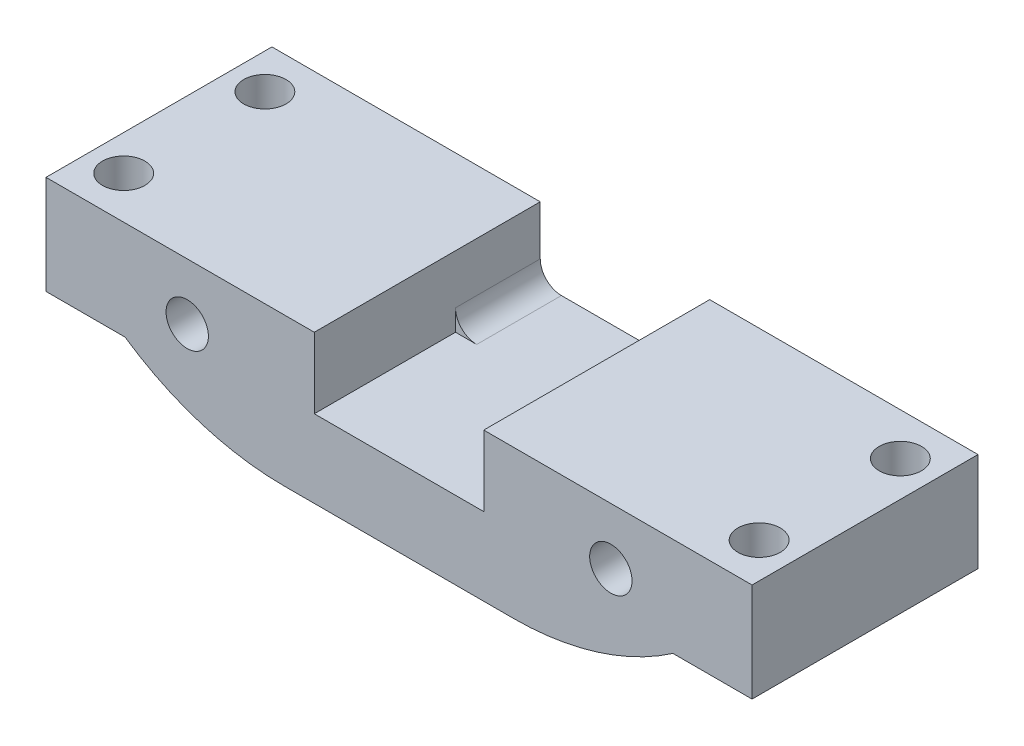
ISO-10303-21;
HEADER;
FILE_DESCRIPTION(('STEP AP214'),'2;1');
FILE_NAME('part.step','',(''),(''),'','','');
FILE_SCHEMA(('AUTOMOTIVE_DESIGN { 1 0 10303 214 1 1 1 1 }'));
ENDSEC;
DATA;
#1=APPLICATION_CONTEXT('core data for automotive mechanical design processes');
#2=APPLICATION_PROTOCOL_DEFINITION('international standard','automotive_design',2000,#1);
#3=PRODUCT_CONTEXT('',#1,'mechanical');
#4=PRODUCT('Part','Part','',(#3));
#5=PRODUCT_RELATED_PRODUCT_CATEGORY('part','',(#4));
#6=PRODUCT_DEFINITION_FORMATION('','',#4);
#7=PRODUCT_DEFINITION_CONTEXT('part definition',#1,'design');
#8=PRODUCT_DEFINITION('design','',#6,#7);
#9=PRODUCT_DEFINITION_SHAPE('','',#8);
#10=(LENGTH_UNIT() NAMED_UNIT(*) SI_UNIT(.MILLI.,.METRE.));
#11=(NAMED_UNIT(*) PLANE_ANGLE_UNIT() SI_UNIT($,.RADIAN.));
#12=(NAMED_UNIT(*) SI_UNIT($,.STERADIAN.) SOLID_ANGLE_UNIT());
#13=UNCERTAINTY_MEASURE_WITH_UNIT(LENGTH_MEASURE(1.E-05),#10,'distance_accuracy_value','');
#14=(GEOMETRIC_REPRESENTATION_CONTEXT(3) GLOBAL_UNCERTAINTY_ASSIGNED_CONTEXT((#13)) GLOBAL_UNIT_ASSIGNED_CONTEXT((#10,
#11,#12)) REPRESENTATION_CONTEXT('',''));
#15=CARTESIAN_POINT('',(0.,0.,0.));
#16=DIRECTION('',(0.,0.,1.));
#17=DIRECTION('',(1.,0.,0.));
#18=AXIS2_PLACEMENT_3D('',#15,#16,#17);
#19=CARTESIAN_POINT('',(0.,14.9,10.));
#20=DIRECTION('',(0.,1.,0.));
#21=DIRECTION('',(-1.,0.,0.));
#22=AXIS2_PLACEMENT_3D('',#19,#20,#21);
#23=PLANE('',#22);
#24=CARTESIAN_POINT('',(45.5,14.9,7.));
#25=DIRECTION('',(0.,1.,0.));
#26=DIRECTION('',(-1.,0.,0.));
#27=AXIS2_PLACEMENT_3D('',#24,#25,#26);
#28=CIRCLE('',#27,1.5);
#29=CARTESIAN_POINT('',(44.,14.9,7.));
#30=VERTEX_POINT('',#29);
#31=EDGE_CURVE('E355',#30,#30,#28,.T.);
#32=ORIENTED_EDGE('',*,*,#31,.F.);
#33=EDGE_LOOP('',(#32));
#34=FACE_BOUND('',#33,.T.);
#35=CARTESIAN_POINT('',(45.4999999999999,14.9,-3.00000000000001));
#36=DIRECTION('',(0.,1.,0.));
#37=DIRECTION('',(-1.,0.,0.));
#38=AXIS2_PLACEMENT_3D('',#35,#36,#37);
#39=CIRCLE('',#38,1.5);
#40=CARTESIAN_POINT('',(43.9999999999999,14.9,-3.00000000000001));
#41=VERTEX_POINT('',#40);
#42=EDGE_CURVE('E351',#41,#41,#39,.T.);
#43=ORIENTED_EDGE('',*,*,#42,.F.);
#44=EDGE_LOOP('',(#43));
#45=FACE_BOUND('',#44,.T.);
#46=DIRECTION('',(0.,0.,-1.));
#47=VECTOR('',#46,1.);
#48=CARTESIAN_POINT('',(48.,14.9,10.));
#49=LINE('',#48,#47);
#50=CARTESIAN_POINT('',(48.,14.9,10.));
#51=VERTEX_POINT('',#50);
#52=CARTESIAN_POINT('',(48.,14.9,-6.));
#53=VERTEX_POINT('',#52);
#54=EDGE_CURVE('E168',#51,#53,#49,.T.);
#55=ORIENTED_EDGE('',*,*,#54,.T.);
#56=DIRECTION('',(1.,0.,0.));
#57=VECTOR('',#56,1.);
#58=CARTESIAN_POINT('',(29.,14.9,-6.));
#59=LINE('',#58,#57);
#60=CARTESIAN_POINT('',(29.,14.9,-6.));
#61=VERTEX_POINT('',#60);
#62=EDGE_CURVE('E184',#61,#53,#59,.T.);
#63=ORIENTED_EDGE('',*,*,#62,.F.);
#64=DIRECTION('',(0.,0.,-1.));
#65=VECTOR('',#64,1.);
#66=CARTESIAN_POINT('',(29.,14.9,10.));
#67=LINE('',#66,#65);
#68=CARTESIAN_POINT('',(29.,14.9,10.));
#69=VERTEX_POINT('',#68);
#70=EDGE_CURVE('E337',#69,#61,#67,.T.);
#71=ORIENTED_EDGE('',*,*,#70,.F.);
#72=DIRECTION('',(1.,0.,0.));
#73=VECTOR('',#72,1.);
#74=CARTESIAN_POINT('',(0.,14.9,10.));
#75=LINE('',#74,#73);
#76=EDGE_CURVE('E262',#69,#51,#75,.T.);
#77=ORIENTED_EDGE('',*,*,#76,.T.);
#78=EDGE_LOOP('',(#55,#63,#71,#77));
#79=FACE_BOUND('',#78,.T.);
#80=ADVANCED_FACE('F41',(#34,#45,#79),#23,.T.);
#81=CARTESIAN_POINT('',(29.,0.,10.));
#82=DIRECTION('',(1.,0.,0.));
#83=DIRECTION('',(0.,0.,-1.));
#84=AXIS2_PLACEMENT_3D('',#81,#82,#83);
#85=PLANE('',#84);
#86=ORIENTED_EDGE('',*,*,#70,.T.);
#87=DIRECTION('',(0.,1.,0.));
#88=VECTOR('',#87,1.);
#89=CARTESIAN_POINT('',(29.,11.4,-6.));
#90=LINE('',#89,#88);
#91=CARTESIAN_POINT('',(29.,11.4,-6.));
#92=VERTEX_POINT('',#91);
#93=EDGE_CURVE('E230',#92,#61,#90,.T.);
#94=ORIENTED_EDGE('',*,*,#93,.F.);
#95=DIRECTION('',(0.,0.,1.));
#96=VECTOR('',#95,1.);
#97=CARTESIAN_POINT('',(29.,11.4,-6.));
#98=LINE('',#97,#96);
#99=CARTESIAN_POINT('',(29.,11.4,0.));
#100=VERTEX_POINT('',#99);
#101=EDGE_CURVE('E235',#92,#100,#98,.T.);
#102=ORIENTED_EDGE('',*,*,#101,.T.);
#103=DIRECTION('',(0.,-1.,0.));
#104=VECTOR('',#103,1.);
#105=CARTESIAN_POINT('',(29.,0.,0.));
#106=LINE('',#105,#104);
#107=CARTESIAN_POINT('',(29.,9.9,0.));
#108=VERTEX_POINT('',#107);
#109=EDGE_CURVE('E303',#100,#108,#106,.T.);
#110=ORIENTED_EDGE('',*,*,#109,.T.);
#111=DIRECTION('',(0.,0.,-1.));
#112=VECTOR('',#111,1.);
#113=CARTESIAN_POINT('',(29.,9.9,10.));
#114=LINE('',#113,#112);
#115=CARTESIAN_POINT('',(29.,9.9,10.));
#116=VERTEX_POINT('',#115);
#117=EDGE_CURVE('E333',#116,#108,#114,.T.);
#118=ORIENTED_EDGE('',*,*,#117,.F.);
#119=DIRECTION('',(0.,-1.,0.));
#120=VECTOR('',#119,1.);
#121=CARTESIAN_POINT('',(29.,0.,10.));
#122=LINE('',#121,#120);
#123=EDGE_CURVE('E266',#69,#116,#122,.T.);
#124=ORIENTED_EDGE('',*,*,#123,.F.);
#125=EDGE_LOOP('',(#86,#94,#102,#110,#118,#124));
#126=FACE_BOUND('',#125,.T.);
#127=ADVANCED_FACE('F379',(#126),#85,.F.);
#128=CARTESIAN_POINT('',(0.,9.9,10.));
#129=DIRECTION('',(0.,1.,0.));
#130=DIRECTION('',(0.,0.,1.));
#131=AXIS2_PLACEMENT_3D('',#128,#129,#130);
#132=PLANE('',#131);
#133=DIRECTION('',(1.,0.,0.));
#134=VECTOR('',#133,1.);
#135=CARTESIAN_POINT('',(0.,9.9,0.));
#136=LINE('',#135,#134);
#137=CARTESIAN_POINT('',(17.,9.9,0.));
#138=VERTEX_POINT('',#137);
#139=CARTESIAN_POINT('',(18.5,9.9,0.));
#140=VERTEX_POINT('',#139);
#141=EDGE_CURVE('E308',#138,#140,#136,.T.);
#142=ORIENTED_EDGE('',*,*,#141,.F.);
#143=DIRECTION('',(0.,0.,-1.));
#144=VECTOR('',#143,1.);
#145=CARTESIAN_POINT('',(17.,9.9,10.));
#146=LINE('',#145,#144);
#147=CARTESIAN_POINT('',(17.,9.9,10.));
#148=VERTEX_POINT('',#147);
#149=EDGE_CURVE('E329',#148,#138,#146,.T.);
#150=ORIENTED_EDGE('',*,*,#149,.F.);
#151=DIRECTION('',(1.,0.,0.));
#152=VECTOR('',#151,1.);
#153=CARTESIAN_POINT('',(0.,9.9,10.));
#154=LINE('',#153,#152);
#155=EDGE_CURVE('E269',#148,#116,#154,.T.);
#156=ORIENTED_EDGE('',*,*,#155,.T.);
#157=ORIENTED_EDGE('',*,*,#117,.T.);
#158=CARTESIAN_POINT('',(27.5,9.9,0.));
#159=VERTEX_POINT('',#158);
#160=EDGE_CURVE('E307',#159,#108,#136,.T.);
#161=ORIENTED_EDGE('',*,*,#160,.F.);
#162=DIRECTION('',(0.,0.,1.));
#163=VECTOR('',#162,1.);
#164=CARTESIAN_POINT('',(27.5,9.9,-6.));
#165=LINE('',#164,#163);
#166=CARTESIAN_POINT('',(27.5,9.9,-6.));
#167=VERTEX_POINT('',#166);
#168=EDGE_CURVE('E242',#167,#159,#165,.T.);
#169=ORIENTED_EDGE('',*,*,#168,.F.);
#170=DIRECTION('',(1.,0.,0.));
#171=VECTOR('',#170,1.);
#172=CARTESIAN_POINT('',(18.5,9.9,-6.));
#173=LINE('',#172,#171);
#174=CARTESIAN_POINT('',(18.5,9.9,-6.));
#175=VERTEX_POINT('',#174);
#176=EDGE_CURVE('E224',#175,#167,#173,.T.);
#177=ORIENTED_EDGE('',*,*,#176,.F.);
#178=DIRECTION('',(0.,0.,1.));
#179=VECTOR('',#178,1.);
#180=CARTESIAN_POINT('',(18.5,9.9,-6.));
#181=LINE('',#180,#179);
#182=EDGE_CURVE('E245',#175,#140,#181,.T.);
#183=ORIENTED_EDGE('',*,*,#182,.T.);
#184=EDGE_LOOP('',(#142,#150,#156,#157,#161,#169,#177,#183));
#185=FACE_BOUND('',#184,.T.);
#186=ADVANCED_FACE('F414',(#185),#132,.T.);
#187=CARTESIAN_POINT('',(17.,0.,10.));
#188=DIRECTION('',(1.,0.,0.));
#189=DIRECTION('',(0.,0.,-1.));
#190=AXIS2_PLACEMENT_3D('',#187,#188,#189);
#191=PLANE('',#190);
#192=DIRECTION('',(0.,-1.,0.));
#193=VECTOR('',#192,1.);
#194=CARTESIAN_POINT('',(17.,0.,0.));
#195=LINE('',#194,#193);
#196=CARTESIAN_POINT('',(17.,11.4,0.));
#197=VERTEX_POINT('',#196);
#198=EDGE_CURVE('E258',#197,#138,#195,.T.);
#199=ORIENTED_EDGE('',*,*,#198,.F.);
#200=DIRECTION('',(0.,0.,1.));
#201=VECTOR('',#200,1.);
#202=CARTESIAN_POINT('',(17.,11.4,-6.));
#203=LINE('',#202,#201);
#204=CARTESIAN_POINT('',(17.,11.4,-6.));
#205=VERTEX_POINT('',#204);
#206=EDGE_CURVE('E249',#205,#197,#203,.T.);
#207=ORIENTED_EDGE('',*,*,#206,.F.);
#208=DIRECTION('',(0.,-1.,0.));
#209=VECTOR('',#208,1.);
#210=CARTESIAN_POINT('',(17.,14.9,-6.));
#211=LINE('',#210,#209);
#212=CARTESIAN_POINT('',(17.,14.9,-6.));
#213=VERTEX_POINT('',#212);
#214=EDGE_CURVE('E218',#213,#205,#211,.T.);
#215=ORIENTED_EDGE('',*,*,#214,.F.);
#216=DIRECTION('',(0.,0.,-1.));
#217=VECTOR('',#216,1.);
#218=CARTESIAN_POINT('',(17.,14.9,10.));
#219=LINE('',#218,#217);
#220=CARTESIAN_POINT('',(17.,14.9,10.));
#221=VERTEX_POINT('',#220);
#222=EDGE_CURVE('E326',#221,#213,#219,.T.);
#223=ORIENTED_EDGE('',*,*,#222,.F.);
#224=DIRECTION('',(0.,-1.,0.));
#225=VECTOR('',#224,1.);
#226=CARTESIAN_POINT('',(17.,0.,10.));
#227=LINE('',#226,#225);
#228=EDGE_CURVE('E273',#221,#148,#227,.T.);
#229=ORIENTED_EDGE('',*,*,#228,.T.);
#230=ORIENTED_EDGE('',*,*,#149,.T.);
#231=EDGE_LOOP('',(#199,#207,#215,#223,#229,#230));
#232=FACE_BOUND('',#231,.T.);
#233=ADVANCED_FACE('F408',(#232),#191,.T.);
#234=CARTESIAN_POINT('',(0.,14.9,10.));
#235=DIRECTION('',(0.,1.,0.));
#236=DIRECTION('',(-1.,0.,0.));
#237=AXIS2_PLACEMENT_3D('',#234,#235,#236);
#238=PLANE('',#237);
#239=CARTESIAN_POINT('',(0.499999999999979,14.9,-3.));
#240=DIRECTION('',(0.,1.,0.));
#241=DIRECTION('',(-1.,0.,0.));
#242=AXIS2_PLACEMENT_3D('',#239,#240,#241);
#243=CIRCLE('',#242,1.5);
#244=CARTESIAN_POINT('',(-1.00000000000002,14.9,-3.));
#245=VERTEX_POINT('',#244);
#246=EDGE_CURVE('E193',#245,#245,#243,.T.);
#247=ORIENTED_EDGE('',*,*,#246,.F.);
#248=EDGE_LOOP('',(#247));
#249=FACE_BOUND('',#248,.T.);
#250=CARTESIAN_POINT('',(0.499999999999975,14.9,7.));
#251=DIRECTION('',(0.,1.,0.));
#252=DIRECTION('',(-1.,0.,0.));
#253=AXIS2_PLACEMENT_3D('',#250,#251,#252);
#254=CIRCLE('',#253,1.5);
#255=CARTESIAN_POINT('',(-1.00000000000002,14.9,7.));
#256=VERTEX_POINT('',#255);
#257=EDGE_CURVE('E359',#256,#256,#254,.T.);
#258=ORIENTED_EDGE('',*,*,#257,.F.);
#259=EDGE_LOOP('',(#258));
#260=FACE_BOUND('',#259,.T.);
#261=ORIENTED_EDGE('',*,*,#222,.T.);
#262=DIRECTION('',(1.,0.,0.));
#263=VECTOR('',#262,1.);
#264=CARTESIAN_POINT('',(-2.00000000000002,14.9,-6.));
#265=LINE('',#264,#263);
#266=CARTESIAN_POINT('',(-2.00000000000002,14.9,-6.));
#267=VERTEX_POINT('',#266);
#268=EDGE_CURVE('E214',#267,#213,#265,.T.);
#269=ORIENTED_EDGE('',*,*,#268,.F.);
#270=DIRECTION('',(0.,0.,-1.));
#271=VECTOR('',#270,1.);
#272=CARTESIAN_POINT('',(-2.00000000000002,14.9,10.));
#273=LINE('',#272,#271);
#274=CARTESIAN_POINT('',(-2.00000000000002,14.9,10.));
#275=VERTEX_POINT('',#274);
#276=EDGE_CURVE('E323',#275,#267,#273,.T.);
#277=ORIENTED_EDGE('',*,*,#276,.F.);
#278=DIRECTION('',(1.,0.,0.));
#279=VECTOR('',#278,1.);
#280=CARTESIAN_POINT('',(0.,14.9,10.));
#281=LINE('',#280,#279);
#282=EDGE_CURVE('E277',#275,#221,#281,.T.);
#283=ORIENTED_EDGE('',*,*,#282,.T.);
#284=EDGE_LOOP('',(#261,#269,#277,#283));
#285=FACE_BOUND('',#284,.T.);
#286=ADVANCED_FACE('F404',(#249,#260,#285),#238,.T.);
#287=CARTESIAN_POINT('',(-2.00000000000002,0.,10.));
#288=DIRECTION('',(1.,0.,0.));
#289=DIRECTION('',(0.,1.,0.));
#290=AXIS2_PLACEMENT_3D('',#287,#288,#289);
#291=PLANE('',#290);
#292=ORIENTED_EDGE('',*,*,#276,.T.);
#293=DIRECTION('',(0.,1.,0.));
#294=VECTOR('',#293,1.);
#295=CARTESIAN_POINT('',(-2.00000000000002,7.9,-6.));
#296=LINE('',#295,#294);
#297=CARTESIAN_POINT('',(-2.00000000000002,7.9,-6.));
#298=VERTEX_POINT('',#297);
#299=EDGE_CURVE('E210',#298,#267,#296,.T.);
#300=ORIENTED_EDGE('',*,*,#299,.F.);
#301=DIRECTION('',(0.,0.,-1.));
#302=VECTOR('',#301,1.);
#303=CARTESIAN_POINT('',(-2.00000000000002,7.9,10.));
#304=LINE('',#303,#302);
#305=CARTESIAN_POINT('',(-2.00000000000002,7.9,10.));
#306=VERTEX_POINT('',#305);
#307=EDGE_CURVE('E320',#306,#298,#304,.T.);
#308=ORIENTED_EDGE('',*,*,#307,.F.);
#309=DIRECTION('',(0.,-1.,0.));
#310=VECTOR('',#309,1.);
#311=CARTESIAN_POINT('',(-2.00000000000002,0.,10.));
#312=LINE('',#311,#310);
#313=EDGE_CURVE('E281',#275,#306,#312,.T.);
#314=ORIENTED_EDGE('',*,*,#313,.F.);
#315=EDGE_LOOP('',(#292,#300,#308,#314));
#316=FACE_BOUND('',#315,.T.);
#317=ADVANCED_FACE('F399',(#316),#291,.F.);
#318=CARTESIAN_POINT('',(0.,7.9,10.));
#319=DIRECTION('',(0.,-1.,0.));
#320=DIRECTION('',(0.,0.,-1.));
#321=AXIS2_PLACEMENT_3D('',#318,#319,#320);
#322=PLANE('',#321);
#323=CARTESIAN_POINT('',(0.499999999999981,7.9,-3.));
#324=DIRECTION('',(0.,-1.,0.));
#325=DIRECTION('',(0.,0.,-1.));
#326=AXIS2_PLACEMENT_3D('',#323,#324,#325);
#327=CIRCLE('',#326,1.5);
#328=CARTESIAN_POINT('',(0.499999999999981,7.9,-4.5));
#329=VERTEX_POINT('',#328);
#330=EDGE_CURVE('E45',#329,#329,#327,.T.);
#331=ORIENTED_EDGE('',*,*,#330,.F.);
#332=EDGE_LOOP('',(#331));
#333=FACE_BOUND('',#332,.T.);
#334=CARTESIAN_POINT('',(0.499999999999977,7.9,7.));
#335=DIRECTION('',(0.,-1.,0.));
#336=DIRECTION('',(0.,0.,-1.));
#337=AXIS2_PLACEMENT_3D('',#334,#335,#336);
#338=CIRCLE('',#337,1.5);
#339=CARTESIAN_POINT('',(0.499999999999977,7.9,5.5));
#340=VERTEX_POINT('',#339);
#341=EDGE_CURVE('E356',#340,#340,#338,.T.);
#342=ORIENTED_EDGE('',*,*,#341,.F.);
#343=EDGE_LOOP('',(#342));
#344=FACE_BOUND('',#343,.T.);
#345=ORIENTED_EDGE('',*,*,#307,.T.);
#346=DIRECTION('',(-1.,0.,0.));
#347=VECTOR('',#346,1.);
#348=CARTESIAN_POINT('',(3.5980762113533,7.90000000000001,-6.));
#349=LINE('',#348,#347);
#350=CARTESIAN_POINT('',(3.5980762113533,7.90000000000001,-6.));
#351=VERTEX_POINT('',#350);
#352=EDGE_CURVE('E206',#351,#298,#349,.T.);
#353=ORIENTED_EDGE('',*,*,#352,.F.);
#354=DIRECTION('',(0.,0.,-1.));
#355=VECTOR('',#354,1.);
#356=CARTESIAN_POINT('',(3.5980762113533,7.9,10.));
#357=LINE('',#356,#355);
#358=CARTESIAN_POINT('',(3.5980762113533,7.9,10.));
#359=VERTEX_POINT('',#358);
#360=EDGE_CURVE('E317',#359,#351,#357,.T.);
#361=ORIENTED_EDGE('',*,*,#360,.F.);
#362=DIRECTION('',(-1.,0.,0.));
#363=VECTOR('',#362,1.);
#364=CARTESIAN_POINT('',(0.,7.9,10.));
#365=LINE('',#364,#363);
#366=EDGE_CURVE('E284',#359,#306,#365,.T.);
#367=ORIENTED_EDGE('',*,*,#366,.T.);
#368=EDGE_LOOP('',(#345,#353,#361,#367));
#369=FACE_BOUND('',#368,.T.);
#370=ADVANCED_FACE('F395',(#333,#344,#369),#322,.T.);
#371=CARTESIAN_POINT('',(0.,4.4,10.));
#372=DIRECTION('',(0.,1.,0.));
#373=DIRECTION('',(-1.,0.,0.));
#374=AXIS2_PLACEMENT_3D('',#371,#372,#373);
#375=PLANE('',#374);
#376=DIRECTION('',(0.,0.,-1.));
#377=VECTOR('',#376,1.);
#378=CARTESIAN_POINT('',(14.9007307668106,4.40000000000001,10.));
#379=LINE('',#378,#377);
#380=CARTESIAN_POINT('',(14.9007307668106,4.40000000000001,10.));
#381=VERTEX_POINT('',#380);
#382=CARTESIAN_POINT('',(14.9007307668106,4.40000000000001,-6.));
#383=VERTEX_POINT('',#382);
#384=EDGE_CURVE('E340',#381,#383,#379,.T.);
#385=ORIENTED_EDGE('',*,*,#384,.T.);
#386=DIRECTION('',(-1.,0.,0.));
#387=VECTOR('',#386,1.);
#388=CARTESIAN_POINT('',(31.0973454445427,4.40000000000001,-6.));
#389=LINE('',#388,#387);
#390=CARTESIAN_POINT('',(31.0973454445427,4.40000000000001,-6.));
#391=VERTEX_POINT('',#390);
#392=EDGE_CURVE('E198',#391,#383,#389,.T.);
#393=ORIENTED_EDGE('',*,*,#392,.F.);
#394=DIRECTION('',(0.,0.,-1.));
#395=VECTOR('',#394,1.);
#396=CARTESIAN_POINT('',(31.0973454445427,4.40000000000001,10.));
#397=LINE('',#396,#395);
#398=CARTESIAN_POINT('',(31.0973454445427,4.40000000000001,10.));
#399=VERTEX_POINT('',#398);
#400=EDGE_CURVE('E59',#391,#399,#397,.F.);
#401=ORIENTED_EDGE('',*,*,#400,.T.);
#402=DIRECTION('',(1.,0.,0.));
#403=VECTOR('',#402,1.);
#404=CARTESIAN_POINT('',(0.,4.4,10.));
#405=LINE('',#404,#403);
#406=EDGE_CURVE('E288',#381,#399,#405,.T.);
#407=ORIENTED_EDGE('',*,*,#406,.F.);
#408=EDGE_LOOP('',(#385,#393,#401,#407));
#409=FACE_BOUND('',#408,.T.);
#410=ADVANCED_FACE('F389',(#409),#375,.F.);
#411=CARTESIAN_POINT('',(0.,7.9,10.));
#412=DIRECTION('',(0.,-1.,0.));
#413=DIRECTION('',(1.,0.,0.));
#414=AXIS2_PLACEMENT_3D('',#411,#412,#413);
#415=PLANE('',#414);
#416=CARTESIAN_POINT('',(45.5,7.90000000000001,7.));
#417=DIRECTION('',(0.,-1.,0.));
#418=DIRECTION('',(1.,0.,0.));
#419=AXIS2_PLACEMENT_3D('',#416,#417,#418);
#420=CIRCLE('',#419,1.5);
#421=CARTESIAN_POINT('',(47.,7.90000000000001,7.));
#422=VERTEX_POINT('',#421);
#423=EDGE_CURVE('E352',#422,#422,#420,.T.);
#424=ORIENTED_EDGE('',*,*,#423,.F.);
#425=EDGE_LOOP('',(#424));
#426=FACE_BOUND('',#425,.T.);
#427=CARTESIAN_POINT('',(45.4999999999999,7.90000000000001,-3.00000000000001));
#428=DIRECTION('',(0.,-1.,0.));
#429=DIRECTION('',(1.,0.,0.));
#430=AXIS2_PLACEMENT_3D('',#427,#428,#429);
#431=CIRCLE('',#430,1.5);
#432=CARTESIAN_POINT('',(46.9999999999999,7.90000000000001,-3.00000000000001));
#433=VERTEX_POINT('',#432);
#434=EDGE_CURVE('E347',#433,#433,#431,.T.);
#435=ORIENTED_EDGE('',*,*,#434,.F.);
#436=EDGE_LOOP('',(#435));
#437=FACE_BOUND('',#436,.T.);
#438=DIRECTION('',(0.,0.,-1.));
#439=VECTOR('',#438,1.);
#440=CARTESIAN_POINT('',(42.4,7.90000000000001,10.));
#441=LINE('',#440,#439);
#442=CARTESIAN_POINT('',(42.4,7.90000000000001,10.));
#443=VERTEX_POINT('',#442);
#444=CARTESIAN_POINT('',(42.4,7.90000000000001,-6.));
#445=VERTEX_POINT('',#444);
#446=EDGE_CURVE('E167',#443,#445,#441,.T.);
#447=ORIENTED_EDGE('',*,*,#446,.T.);
#448=DIRECTION('',(-1.,0.,0.));
#449=VECTOR('',#448,1.);
#450=CARTESIAN_POINT('',(48.,7.90000000000001,-6.));
#451=LINE('',#450,#449);
#452=CARTESIAN_POINT('',(48.,7.90000000000001,-6.));
#453=VERTEX_POINT('',#452);
#454=EDGE_CURVE('E171',#453,#445,#451,.T.);
#455=ORIENTED_EDGE('',*,*,#454,.F.);
#456=DIRECTION('',(0.,0.,-1.));
#457=VECTOR('',#456,1.);
#458=CARTESIAN_POINT('',(48.,7.90000000000001,10.));
#459=LINE('',#458,#457);
#460=CARTESIAN_POINT('',(48.,7.90000000000001,10.));
#461=VERTEX_POINT('',#460);
#462=EDGE_CURVE('E156',#461,#453,#459,.T.);
#463=ORIENTED_EDGE('',*,*,#462,.F.);
#464=DIRECTION('',(-1.,0.,0.));
#465=VECTOR('',#464,1.);
#466=CARTESIAN_POINT('',(0.,7.9,10.));
#467=LINE('',#466,#465);
#468=EDGE_CURVE('E291',#461,#443,#467,.T.);
#469=ORIENTED_EDGE('',*,*,#468,.T.);
#470=EDGE_LOOP('',(#447,#455,#463,#469));
#471=FACE_BOUND('',#470,.T.);
#472=ADVANCED_FACE('F172',(#426,#437,#471),#415,.T.);
#473=CARTESIAN_POINT('',(7.99999999999999,10.9,10.));
#474=DIRECTION('',(0.,0.,-1.));
#475=DIRECTION('',(-1.,0.,0.));
#476=AXIS2_PLACEMENT_3D('',#473,#474,#475);
#477=CYLINDRICAL_SURFACE('',#476,1.5);
#478=CARTESIAN_POINT('',(7.99999999999999,10.9,10.));
#479=DIRECTION('',(0.,0.,1.));
#480=DIRECTION('',(1.,0.,0.));
#481=AXIS2_PLACEMENT_3D('',#478,#479,#480);
#482=CIRCLE('',#481,1.5);
#483=CARTESIAN_POINT('',(9.49999999999998,10.9,10.));
#484=VERTEX_POINT('',#483);
#485=EDGE_CURVE('E257',#484,#484,#482,.T.);
#486=ORIENTED_EDGE('',*,*,#485,.T.);
#487=EDGE_LOOP('',(#486));
#488=FACE_BOUND('',#487,.T.);
#489=CARTESIAN_POINT('',(7.99999999999999,10.9,0.));
#490=DIRECTION('',(0.,0.,1.));
#491=DIRECTION('',(1.,0.,0.));
#492=AXIS2_PLACEMENT_3D('',#489,#490,#491);
#493=CIRCLE('',#492,1.5);
#494=CARTESIAN_POINT('',(9.49999999999998,10.9,0.));
#495=VERTEX_POINT('',#494);
#496=EDGE_CURVE('E299',#495,#495,#493,.T.);
#497=ORIENTED_EDGE('',*,*,#496,.F.);
#498=EDGE_LOOP('',(#497));
#499=FACE_BOUND('',#498,.T.);
#500=ADVANCED_FACE('F459',(#488,#499),#477,.F.);
#501=CARTESIAN_POINT('',(38.,10.9,10.));
#502=DIRECTION('',(0.,0.,-1.));
#503=DIRECTION('',(-1.,0.,0.));
#504=AXIS2_PLACEMENT_3D('',#501,#502,#503);
#505=CYLINDRICAL_SURFACE('',#504,1.5);
#506=CARTESIAN_POINT('',(38.,10.9,10.));
#507=DIRECTION('',(0.,0.,1.));
#508=DIRECTION('',(1.,0.,0.));
#509=AXIS2_PLACEMENT_3D('',#506,#507,#508);
#510=CIRCLE('',#509,1.5);
#511=CARTESIAN_POINT('',(39.5,10.9,10.));
#512=VERTEX_POINT('',#511);
#513=EDGE_CURVE('E253',#512,#512,#510,.T.);
#514=ORIENTED_EDGE('',*,*,#513,.T.);
#515=EDGE_LOOP('',(#514));
#516=FACE_BOUND('',#515,.T.);
#517=CARTESIAN_POINT('',(38.,10.9,0.));
#518=DIRECTION('',(0.,0.,1.));
#519=DIRECTION('',(1.,0.,0.));
#520=AXIS2_PLACEMENT_3D('',#517,#518,#519);
#521=CIRCLE('',#520,1.5);
#522=CARTESIAN_POINT('',(39.5,10.9,0.));
#523=VERTEX_POINT('',#522);
#524=EDGE_CURVE('E252',#523,#523,#521,.T.);
#525=ORIENTED_EDGE('',*,*,#524,.F.);
#526=EDGE_LOOP('',(#525));
#527=FACE_BOUND('',#526,.T.);
#528=ADVANCED_FACE('F457',(#516,#527),#505,.F.);
#529=CARTESIAN_POINT('',(48.,0.,10.));
#530=DIRECTION('',(1.,0.,0.));
#531=DIRECTION('',(0.,1.,0.));
#532=AXIS2_PLACEMENT_3D('',#529,#530,#531);
#533=PLANE('',#532);
#534=ORIENTED_EDGE('',*,*,#462,.T.);
#535=DIRECTION('',(0.,-1.,0.));
#536=VECTOR('',#535,1.);
#537=CARTESIAN_POINT('',(48.,14.9,-6.));
#538=LINE('',#537,#536);
#539=EDGE_CURVE('E160',#53,#453,#538,.T.);
#540=ORIENTED_EDGE('',*,*,#539,.F.);
#541=ORIENTED_EDGE('',*,*,#54,.F.);
#542=DIRECTION('',(0.,-1.,0.));
#543=VECTOR('',#542,1.);
#544=CARTESIAN_POINT('',(48.,0.,10.));
#545=LINE('',#544,#543);
#546=EDGE_CURVE('E162',#51,#461,#545,.T.);
#547=ORIENTED_EDGE('',*,*,#546,.T.);
#548=EDGE_LOOP('',(#534,#540,#541,#547));
#549=FACE_BOUND('',#548,.T.);
#550=ADVANCED_FACE('F158',(#549),#533,.T.);
#551=CARTESIAN_POINT('',(0.,0.,10.));
#552=DIRECTION('',(0.,0.,1.));
#553=DIRECTION('',(1.,0.,0.));
#554=AXIS2_PLACEMENT_3D('',#551,#552,#553);
#555=PLANE('',#554);
#556=ORIENTED_EDGE('',*,*,#513,.F.);
#557=EDGE_LOOP('',(#556));
#558=FACE_BOUND('',#557,.T.);
#559=ORIENTED_EDGE('',*,*,#485,.F.);
#560=EDGE_LOOP('',(#559));
#561=FACE_BOUND('',#560,.T.);
#562=ORIENTED_EDGE('',*,*,#406,.T.);
#563=CARTESIAN_POINT('',(31.0973454445427,24.4,10.));
#564=DIRECTION('',(0.,0.,1.));
#565=DIRECTION('',(1.,0.,0.));
#566=AXIS2_PLACEMENT_3D('',#563,#564,#565);
#567=CIRCLE('',#566,20.);
#568=EDGE_CURVE('E11',#399,#443,#567,.T.);
#569=ORIENTED_EDGE('',*,*,#568,.T.);
#570=ORIENTED_EDGE('',*,*,#468,.F.);
#571=ORIENTED_EDGE('',*,*,#546,.F.);
#572=ORIENTED_EDGE('',*,*,#76,.F.);
#573=ORIENTED_EDGE('',*,*,#123,.T.);
#574=ORIENTED_EDGE('',*,*,#155,.F.);
#575=ORIENTED_EDGE('',*,*,#228,.F.);
#576=ORIENTED_EDGE('',*,*,#282,.F.);
#577=ORIENTED_EDGE('',*,*,#313,.T.);
#578=ORIENTED_EDGE('',*,*,#366,.F.);
#579=CARTESIAN_POINT('',(14.9007307668106,24.4,10.));
#580=DIRECTION('',(0.,0.,1.));
#581=DIRECTION('',(1.,0.,0.));
#582=AXIS2_PLACEMENT_3D('',#579,#580,#581);
#583=CIRCLE('',#582,20.);
#584=EDGE_CURVE('E51',#359,#381,#583,.T.);
#585=ORIENTED_EDGE('',*,*,#584,.T.);
#586=EDGE_LOOP('',(#562,#569,#570,#571,#572,#573,#574,#575,#576,#577,#578,#585));
#587=FACE_BOUND('',#586,.T.);
#588=ADVANCED_FACE('F384',(#558,#561,#587),#555,.T.);
#589=CARTESIAN_POINT('',(31.0973454445427,24.4,10.));
#590=DIRECTION('',(0.,0.,-1.));
#591=DIRECTION('',(-1.,0.,0.));
#592=AXIS2_PLACEMENT_3D('',#589,#590,#591);
#593=CYLINDRICAL_SURFACE('',#592,20.);
#594=ORIENTED_EDGE('',*,*,#568,.F.);
#595=ORIENTED_EDGE('',*,*,#400,.F.);
#596=CARTESIAN_POINT('',(31.0973454445427,24.4,-6.));
#597=DIRECTION('',(0.,0.,-1.));
#598=DIRECTION('',(-1.,0.,0.));
#599=AXIS2_PLACEMENT_3D('',#596,#597,#598);
#600=CIRCLE('',#599,20.);
#601=EDGE_CURVE('E178',#445,#391,#600,.T.);
#602=ORIENTED_EDGE('',*,*,#601,.F.);
#603=ORIENTED_EDGE('',*,*,#446,.F.);
#604=EDGE_LOOP('',(#594,#595,#602,#603));
#605=FACE_BOUND('',#604,.T.);
#606=ADVANCED_FACE('F387',(#605),#593,.T.);
#607=CARTESIAN_POINT('',(14.9007307668106,24.4,10.));
#608=DIRECTION('',(0.,0.,-1.));
#609=DIRECTION('',(-1.,0.,0.));
#610=AXIS2_PLACEMENT_3D('',#607,#608,#609);
#611=CYLINDRICAL_SURFACE('',#610,20.);
#612=ORIENTED_EDGE('',*,*,#584,.F.);
#613=ORIENTED_EDGE('',*,*,#360,.T.);
#614=CARTESIAN_POINT('',(14.9007307668106,24.4,-6.));
#615=DIRECTION('',(0.,0.,-1.));
#616=DIRECTION('',(-1.,0.,0.));
#617=AXIS2_PLACEMENT_3D('',#614,#615,#616);
#618=CIRCLE('',#617,20.);
#619=EDGE_CURVE('E202',#383,#351,#618,.T.);
#620=ORIENTED_EDGE('',*,*,#619,.F.);
#621=ORIENTED_EDGE('',*,*,#384,.F.);
#622=EDGE_LOOP('',(#612,#613,#620,#621));
#623=FACE_BOUND('',#622,.T.);
#624=ADVANCED_FACE('F43',(#623),#611,.T.);
#625=CARTESIAN_POINT('',(31.0973454445427,24.4,-6.));
#626=DIRECTION('',(0.,0.,-1.));
#627=DIRECTION('',(-1.,0.,0.));
#628=AXIS2_PLACEMENT_3D('',#625,#626,#627);
#629=PLANE('',#628);
#630=ORIENTED_EDGE('',*,*,#539,.T.);
#631=ORIENTED_EDGE('',*,*,#454,.T.);
#632=ORIENTED_EDGE('',*,*,#601,.T.);
#633=ORIENTED_EDGE('',*,*,#392,.T.);
#634=ORIENTED_EDGE('',*,*,#619,.T.);
#635=ORIENTED_EDGE('',*,*,#352,.T.);
#636=ORIENTED_EDGE('',*,*,#299,.T.);
#637=ORIENTED_EDGE('',*,*,#268,.T.);
#638=ORIENTED_EDGE('',*,*,#214,.T.);
#639=CARTESIAN_POINT('',(18.5,11.4,-6.));
#640=DIRECTION('',(0.,0.,1.));
#641=DIRECTION('',(-1.,0.,0.));
#642=AXIS2_PLACEMENT_3D('',#639,#640,#641);
#643=CIRCLE('',#642,1.5);
#644=EDGE_CURVE('E221',#205,#175,#643,.T.);
#645=ORIENTED_EDGE('',*,*,#644,.T.);
#646=ORIENTED_EDGE('',*,*,#176,.T.);
#647=CARTESIAN_POINT('',(27.5,11.4,-6.));
#648=DIRECTION('',(0.,0.,1.));
#649=DIRECTION('',(-1.,0.,0.));
#650=AXIS2_PLACEMENT_3D('',#647,#648,#649);
#651=CIRCLE('',#650,1.5);
#652=EDGE_CURVE('E227',#167,#92,#651,.T.);
#653=ORIENTED_EDGE('',*,*,#652,.T.);
#654=ORIENTED_EDGE('',*,*,#93,.T.);
#655=ORIENTED_EDGE('',*,*,#62,.T.);
#656=EDGE_LOOP('',(#630,#631,#632,#633,#634,#635,#636,#637,#638,#645,#646,#653,#654,#655));
#657=FACE_BOUND('',#656,.T.);
#658=ADVANCED_FACE('F181',(#657),#629,.T.);
#659=CARTESIAN_POINT('',(27.5,11.4,-6.));
#660=DIRECTION('',(0.,0.,1.));
#661=DIRECTION('',(1.,0.,0.));
#662=AXIS2_PLACEMENT_3D('',#659,#660,#661);
#663=CYLINDRICAL_SURFACE('',#662,1.5);
#664=CARTESIAN_POINT('',(27.5,11.4,0.));
#665=DIRECTION('',(0.,0.,1.));
#666=DIRECTION('',(-1.,0.,0.));
#667=AXIS2_PLACEMENT_3D('',#664,#665,#666);
#668=CIRCLE('',#667,1.5);
#669=EDGE_CURVE('E186',#159,#100,#668,.T.);
#670=ORIENTED_EDGE('',*,*,#669,.T.);
#671=ORIENTED_EDGE('',*,*,#101,.F.);
#672=ORIENTED_EDGE('',*,*,#652,.F.);
#673=ORIENTED_EDGE('',*,*,#168,.T.);
#674=EDGE_LOOP('',(#670,#671,#672,#673));
#675=FACE_BOUND('',#674,.T.);
#676=ADVANCED_FACE('F429',(#675),#663,.F.);
#677=CARTESIAN_POINT('',(18.5,11.4,-6.));
#678=DIRECTION('',(0.,0.,1.));
#679=DIRECTION('',(1.,0.,0.));
#680=AXIS2_PLACEMENT_3D('',#677,#678,#679);
#681=CYLINDRICAL_SURFACE('',#680,1.5);
#682=CARTESIAN_POINT('',(18.5,11.4,0.));
#683=DIRECTION('',(0.,0.,1.));
#684=DIRECTION('',(-1.,0.,0.));
#685=AXIS2_PLACEMENT_3D('',#682,#683,#684);
#686=CIRCLE('',#685,1.5);
#687=EDGE_CURVE('E190',#197,#140,#686,.T.);
#688=ORIENTED_EDGE('',*,*,#687,.T.);
#689=ORIENTED_EDGE('',*,*,#182,.F.);
#690=ORIENTED_EDGE('',*,*,#644,.F.);
#691=ORIENTED_EDGE('',*,*,#206,.T.);
#692=EDGE_LOOP('',(#688,#689,#690,#691));
#693=FACE_BOUND('',#692,.T.);
#694=ADVANCED_FACE('F422',(#693),#681,.F.);
#695=CARTESIAN_POINT('',(31.0973454445427,24.4,0.));
#696=DIRECTION('',(0.,0.,-1.));
#697=DIRECTION('',(-1.,0.,0.));
#698=AXIS2_PLACEMENT_3D('',#695,#696,#697);
#699=PLANE('',#698);
#700=ORIENTED_EDGE('',*,*,#669,.F.);
#701=ORIENTED_EDGE('',*,*,#160,.T.);
#702=ORIENTED_EDGE('',*,*,#109,.F.);
#703=EDGE_LOOP('',(#700,#701,#702));
#704=FACE_BOUND('',#703,.T.);
#705=ADVANCED_FACE('F433',(#704),#699,.F.);
#706=ORIENTED_EDGE('',*,*,#687,.F.);
#707=ORIENTED_EDGE('',*,*,#198,.T.);
#708=ORIENTED_EDGE('',*,*,#141,.T.);
#709=EDGE_LOOP('',(#706,#707,#708));
#710=FACE_BOUND('',#709,.T.);
#711=ADVANCED_FACE('F419',(#710),#699,.F.);
#712=ORIENTED_EDGE('',*,*,#496,.T.);
#713=EDGE_LOOP('',(#712));
#714=FACE_BOUND('',#713,.T.);
#715=ADVANCED_FACE('F442',(#714),#699,.F.);
#716=ORIENTED_EDGE('',*,*,#524,.T.);
#717=EDGE_LOOP('',(#716));
#718=FACE_BOUND('',#717,.T.);
#719=ADVANCED_FACE('F437',(#718),#699,.F.);
#720=CARTESIAN_POINT('',(45.4999999999999,4.40000000000001,-3.00000000000001));
#721=DIRECTION('',(0.,1.,0.));
#722=DIRECTION('',(-1.,0.,0.));
#723=AXIS2_PLACEMENT_3D('',#720,#721,#722);
#724=CYLINDRICAL_SURFACE('',#723,1.5);
#725=ORIENTED_EDGE('',*,*,#42,.T.);
#726=EDGE_LOOP('',(#725));
#727=FACE_BOUND('',#726,.T.);
#728=ORIENTED_EDGE('',*,*,#434,.T.);
#729=EDGE_LOOP('',(#728));
#730=FACE_BOUND('',#729,.T.);
#731=ADVANCED_FACE('F374',(#727,#730),#724,.F.);
#732=CARTESIAN_POINT('',(45.5,4.40000000000001,7.));
#733=DIRECTION('',(0.,1.,0.));
#734=DIRECTION('',(-1.,0.,0.));
#735=AXIS2_PLACEMENT_3D('',#732,#733,#734);
#736=CYLINDRICAL_SURFACE('',#735,1.5);
#737=ORIENTED_EDGE('',*,*,#31,.T.);
#738=EDGE_LOOP('',(#737));
#739=FACE_BOUND('',#738,.T.);
#740=ORIENTED_EDGE('',*,*,#423,.T.);
#741=EDGE_LOOP('',(#740));
#742=FACE_BOUND('',#741,.T.);
#743=ADVANCED_FACE('F452',(#739,#742),#736,.F.);
#744=CARTESIAN_POINT('',(0.499999999999978,4.39999999999999,7.));
#745=DIRECTION('',(0.,1.,0.));
#746=DIRECTION('',(-1.,0.,0.));
#747=AXIS2_PLACEMENT_3D('',#744,#745,#746);
#748=CYLINDRICAL_SURFACE('',#747,1.5);
#749=ORIENTED_EDGE('',*,*,#257,.T.);
#750=EDGE_LOOP('',(#749));
#751=FACE_BOUND('',#750,.T.);
#752=ORIENTED_EDGE('',*,*,#341,.T.);
#753=EDGE_LOOP('',(#752));
#754=FACE_BOUND('',#753,.T.);
#755=ADVANCED_FACE('F672',(#751,#754),#748,.F.);
#756=CARTESIAN_POINT('',(0.499999999999982,4.39999999999999,-3.));
#757=DIRECTION('',(0.,1.,0.));
#758=DIRECTION('',(-1.,0.,0.));
#759=AXIS2_PLACEMENT_3D('',#756,#757,#758);
#760=CYLINDRICAL_SURFACE('',#759,1.5);
#761=ORIENTED_EDGE('',*,*,#246,.T.);
#762=EDGE_LOOP('',(#761));
#763=FACE_BOUND('',#762,.T.);
#764=ORIENTED_EDGE('',*,*,#330,.T.);
#765=EDGE_LOOP('',(#764));
#766=FACE_BOUND('',#765,.T.);
#767=ADVANCED_FACE('F680',(#763,#766),#760,.F.);
#768=CLOSED_SHELL('',(#80,#127,#186,#233,#286,#317,#370,#410,#472,#500,#528,#550,#588,#606,#624,
#658,#676,#694,#705,#711,#715,#719,#731,#743,#755,#767));
#769=MANIFOLD_SOLID_BREP('B2',#768);
#770=ADVANCED_BREP_SHAPE_REPRESENTATION('',(#18,#769),#14);
#771=SHAPE_DEFINITION_REPRESENTATION(#9,#770);
ENDSEC;
END-ISO-10303-21;
